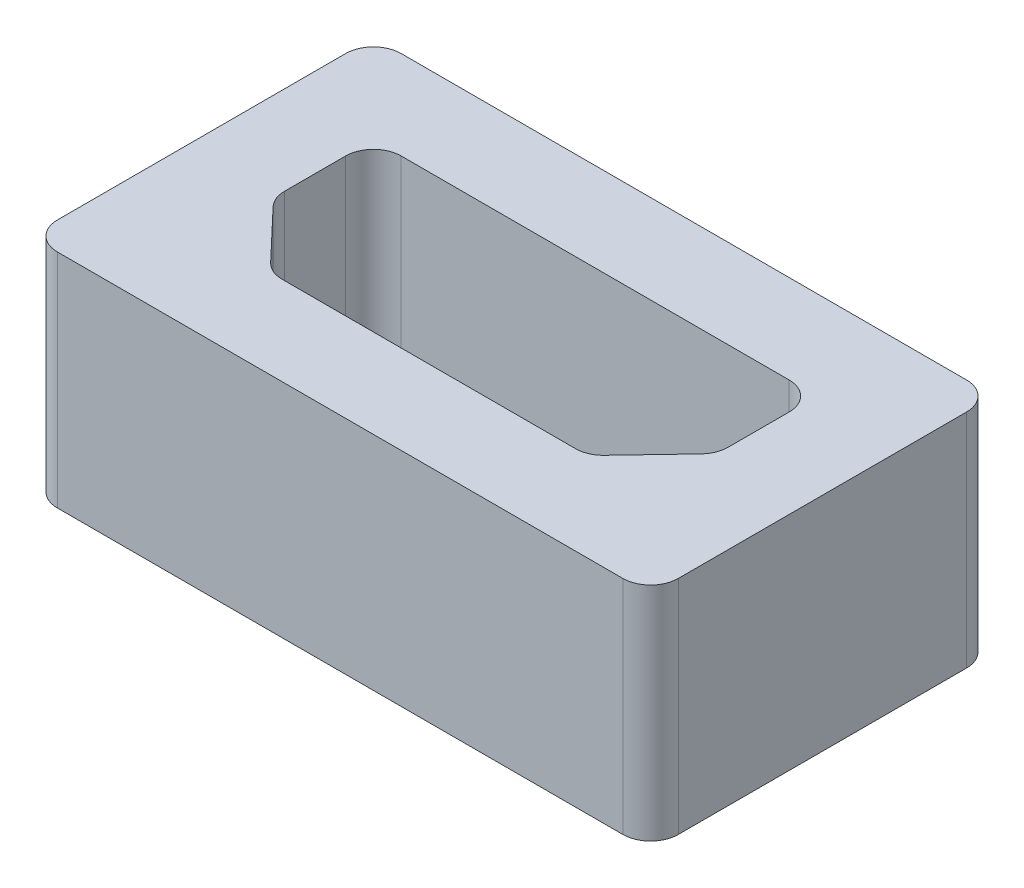
ISO-10303-21;
HEADER;
FILE_DESCRIPTION(('STEP AP214'),'2;1');
FILE_NAME('part.step','',(''),(''),'','','');
FILE_SCHEMA(('AUTOMOTIVE_DESIGN { 1 0 10303 214 1 1 1 1 }'));
ENDSEC;
DATA;
#1=APPLICATION_CONTEXT('core data for automotive mechanical design processes');
#2=APPLICATION_PROTOCOL_DEFINITION('international standard','automotive_design',2000,#1);
#3=PRODUCT_CONTEXT('',#1,'mechanical');
#4=PRODUCT('Part','Part','',(#3));
#5=PRODUCT_RELATED_PRODUCT_CATEGORY('part','',(#4));
#6=PRODUCT_DEFINITION_FORMATION('','',#4);
#7=PRODUCT_DEFINITION_CONTEXT('part definition',#1,'design');
#8=PRODUCT_DEFINITION('design','',#6,#7);
#9=PRODUCT_DEFINITION_SHAPE('','',#8);
#10=(LENGTH_UNIT() NAMED_UNIT(*) SI_UNIT(.MILLI.,.METRE.));
#11=(NAMED_UNIT(*) PLANE_ANGLE_UNIT() SI_UNIT($,.RADIAN.));
#12=(NAMED_UNIT(*) SI_UNIT($,.STERADIAN.) SOLID_ANGLE_UNIT());
#13=UNCERTAINTY_MEASURE_WITH_UNIT(LENGTH_MEASURE(1.E-05),#10,'distance_accuracy_value','');
#14=(GEOMETRIC_REPRESENTATION_CONTEXT(3) GLOBAL_UNCERTAINTY_ASSIGNED_CONTEXT((#13)) GLOBAL_UNIT_ASSIGNED_CONTEXT((#10,
#11,#12)) REPRESENTATION_CONTEXT('',''));
#15=CARTESIAN_POINT('',(0.,0.,0.));
#16=DIRECTION('',(0.,0.,1.));
#17=DIRECTION('',(1.,0.,0.));
#18=AXIS2_PLACEMENT_3D('',#15,#16,#17);
#19=CARTESIAN_POINT('',(0.,4.,-4.6));
#20=DIRECTION('',(0.,0.,-1.));
#21=DIRECTION('',(-1.,0.,0.));
#22=AXIS2_PLACEMENT_3D('',#19,#20,#21);
#23=PLANE('',#22);
#24=DIRECTION('',(1.,0.,0.));
#25=VECTOR('',#24,1.);
#26=CARTESIAN_POINT('',(0.,0.,-4.6));
#27=LINE('',#26,#25);
#28=CARTESIAN_POINT('',(-1.1,0.,-4.6));
#29=VERTEX_POINT('',#28);
#30=CARTESIAN_POINT('',(9.1,0.,-4.6));
#31=VERTEX_POINT('',#30);
#32=EDGE_CURVE('E213',#29,#31,#27,.T.);
#33=ORIENTED_EDGE('',*,*,#32,.F.);
#34=DIRECTION('',(0.,-1.,0.));
#35=VECTOR('',#34,1.);
#36=CARTESIAN_POINT('',(-1.1,4.,-4.6));
#37=LINE('',#36,#35);
#38=CARTESIAN_POINT('',(-1.1,4.,-4.6));
#39=VERTEX_POINT('',#38);
#40=EDGE_CURVE('E263',#29,#39,#37,.F.);
#41=ORIENTED_EDGE('',*,*,#40,.T.);
#42=DIRECTION('',(1.,0.,0.));
#43=VECTOR('',#42,1.);
#44=CARTESIAN_POINT('',(0.,4.,-4.6));
#45=LINE('',#44,#43);
#46=CARTESIAN_POINT('',(9.1,4.,-4.6));
#47=VERTEX_POINT('',#46);
#48=EDGE_CURVE('E333',#39,#47,#45,.T.);
#49=ORIENTED_EDGE('',*,*,#48,.T.);
#50=DIRECTION('',(0.,-1.,0.));
#51=VECTOR('',#50,1.);
#52=CARTESIAN_POINT('',(9.1,0.,-4.6));
#53=LINE('',#52,#51);
#54=EDGE_CURVE('E260',#47,#31,#53,.T.);
#55=ORIENTED_EDGE('',*,*,#54,.T.);
#56=EDGE_LOOP('',(#33,#41,#49,#55));
#57=FACE_BOUND('',#56,.T.);
#58=ADVANCED_FACE('F35',(#57),#23,.T.);
#59=CARTESIAN_POINT('',(-1.6,4.,0.));
#60=DIRECTION('',(-1.,0.,0.));
#61=DIRECTION('',(0.,0.,1.));
#62=AXIS2_PLACEMENT_3D('',#59,#60,#61);
#63=PLANE('',#62);
#64=DIRECTION('',(0.,0.,-1.));
#65=VECTOR('',#64,1.);
#66=CARTESIAN_POINT('',(-1.6,0.,0.));
#67=LINE('',#66,#65);
#68=CARTESIAN_POINT('',(-1.6,0.,1.1));
#69=VERTEX_POINT('',#68);
#70=CARTESIAN_POINT('',(-1.6,0.,-4.1));
#71=VERTEX_POINT('',#70);
#72=EDGE_CURVE('E216',#69,#71,#67,.T.);
#73=ORIENTED_EDGE('',*,*,#72,.F.);
#74=DIRECTION('',(0.,-1.,0.));
#75=VECTOR('',#74,1.);
#76=CARTESIAN_POINT('',(-1.6,4.,1.1));
#77=LINE('',#76,#75);
#78=CARTESIAN_POINT('',(-1.6,4.,1.1));
#79=VERTEX_POINT('',#78);
#80=EDGE_CURVE('E251',#69,#79,#77,.F.);
#81=ORIENTED_EDGE('',*,*,#80,.T.);
#82=DIRECTION('',(0.,0.,-1.));
#83=VECTOR('',#82,1.);
#84=CARTESIAN_POINT('',(-1.6,4.,0.));
#85=LINE('',#84,#83);
#86=CARTESIAN_POINT('',(-1.6,4.,-4.1));
#87=VERTEX_POINT('',#86);
#88=EDGE_CURVE('E336',#79,#87,#85,.T.);
#89=ORIENTED_EDGE('',*,*,#88,.T.);
#90=DIRECTION('',(0.,-1.,0.));
#91=VECTOR('',#90,1.);
#92=CARTESIAN_POINT('',(-1.6,4.,-4.1));
#93=LINE('',#92,#91);
#94=EDGE_CURVE('E248',#87,#71,#93,.T.);
#95=ORIENTED_EDGE('',*,*,#94,.T.);
#96=EDGE_LOOP('',(#73,#81,#89,#95));
#97=FACE_BOUND('',#96,.T.);
#98=ADVANCED_FACE('F375',(#97),#63,.T.);
#99=CARTESIAN_POINT('',(0.,4.,1.6));
#100=DIRECTION('',(0.,0.,-1.));
#101=DIRECTION('',(-1.,0.,0.));
#102=AXIS2_PLACEMENT_3D('',#99,#100,#101);
#103=PLANE('',#102);
#104=DIRECTION('',(1.,0.,0.));
#105=VECTOR('',#104,1.);
#106=CARTESIAN_POINT('',(0.,4.,1.6));
#107=LINE('',#106,#105);
#108=CARTESIAN_POINT('',(-1.1,4.,1.6));
#109=VERTEX_POINT('',#108);
#110=CARTESIAN_POINT('',(9.1,4.,1.6));
#111=VERTEX_POINT('',#110);
#112=EDGE_CURVE('E339',#109,#111,#107,.T.);
#113=ORIENTED_EDGE('',*,*,#112,.F.);
#114=DIRECTION('',(0.,-1.,0.));
#115=VECTOR('',#114,1.);
#116=CARTESIAN_POINT('',(-1.1,0.,1.6));
#117=LINE('',#116,#115);
#118=CARTESIAN_POINT('',(-1.1,0.,1.6));
#119=VERTEX_POINT('',#118);
#120=EDGE_CURVE('E237',#109,#119,#117,.T.);
#121=ORIENTED_EDGE('',*,*,#120,.T.);
#122=DIRECTION('',(1.,0.,0.));
#123=VECTOR('',#122,1.);
#124=CARTESIAN_POINT('',(0.,0.,1.6));
#125=LINE('',#124,#123);
#126=CARTESIAN_POINT('',(9.1,0.,1.6));
#127=VERTEX_POINT('',#126);
#128=EDGE_CURVE('E219',#119,#127,#125,.T.);
#129=ORIENTED_EDGE('',*,*,#128,.T.);
#130=DIRECTION('',(0.,-1.,0.));
#131=VECTOR('',#130,1.);
#132=CARTESIAN_POINT('',(9.1,4.,1.6));
#133=LINE('',#132,#131);
#134=EDGE_CURVE('E235',#127,#111,#133,.F.);
#135=ORIENTED_EDGE('',*,*,#134,.T.);
#136=EDGE_LOOP('',(#113,#121,#129,#135));
#137=FACE_BOUND('',#136,.T.);
#138=ADVANCED_FACE('F381',(#137),#103,.F.);
#139=CARTESIAN_POINT('',(0.,4.,0.));
#140=DIRECTION('',(0.,0.,-1.));
#141=DIRECTION('',(-1.,0.,0.));
#142=AXIS2_PLACEMENT_3D('',#139,#140,#141);
#143=PLANE('',#142);
#144=DIRECTION('',(1.,0.,0.));
#145=VECTOR('',#144,1.);
#146=CARTESIAN_POINT('',(0.,0.,0.));
#147=LINE('',#146,#145);
#148=CARTESIAN_POINT('',(1.35313022490061,0.,0.));
#149=VERTEX_POINT('',#148);
#150=CARTESIAN_POINT('',(6.64686977509939,0.,0.));
#151=VERTEX_POINT('',#150);
#152=EDGE_CURVE('E303',#149,#151,#147,.T.);
#153=ORIENTED_EDGE('',*,*,#152,.F.);
#154=DIRECTION('',(0.,-1.,0.));
#155=VECTOR('',#154,1.);
#156=CARTESIAN_POINT('',(1.35313022490061,4.,0.));
#157=LINE('',#156,#155);
#158=CARTESIAN_POINT('',(1.35313022490061,4.,0.));
#159=VERTEX_POINT('',#158);
#160=EDGE_CURVE('E277',#149,#159,#157,.F.);
#161=ORIENTED_EDGE('',*,*,#160,.T.);
#162=DIRECTION('',(1.,0.,0.));
#163=VECTOR('',#162,1.);
#164=CARTESIAN_POINT('',(0.,4.,0.));
#165=LINE('',#164,#163);
#166=CARTESIAN_POINT('',(6.64686977509939,4.,0.));
#167=VERTEX_POINT('',#166);
#168=EDGE_CURVE('E224',#159,#167,#165,.T.);
#169=ORIENTED_EDGE('',*,*,#168,.T.);
#170=DIRECTION('',(0.,-1.,0.));
#171=VECTOR('',#170,1.);
#172=CARTESIAN_POINT('',(6.64686977509939,0.,0.));
#173=LINE('',#172,#171);
#174=EDGE_CURVE('E274',#167,#151,#173,.T.);
#175=ORIENTED_EDGE('',*,*,#174,.T.);
#176=EDGE_LOOP('',(#153,#161,#169,#175));
#177=FACE_BOUND('',#176,.T.);
#178=ADVANCED_FACE('F320',(#177),#143,.T.);
#179=CARTESIAN_POINT('',(0.598174748818325,4.,-0.56853854528721));
#180=DIRECTION('',(-0.724834509162904,0.,0.688923024964743));
#181=DIRECTION('',(0.688923024964743,0.,0.724834509162904));
#182=AXIS2_PLACEMENT_3D('',#179,#180,#181);
#183=PLANE('',#182);
#184=DIRECTION('',(-0.688923024964743,0.,-0.724834509162904));
#185=VECTOR('',#184,1.);
#186=CARTESIAN_POINT('',(0.598174748818325,4.,-0.56853854528721));
#187=LINE('',#186,#185);
#188=CARTESIAN_POINT('',(0.990712970319155,4.,-0.155538487517629));
#189=VERTEX_POINT('',#188);
#190=CARTESIAN_POINT('',(0.137582745418548,4.,-1.05313982382006));
#191=VERTEX_POINT('',#190);
#192=EDGE_CURVE('E322',#189,#191,#187,.T.);
#193=ORIENTED_EDGE('',*,*,#192,.F.);
#194=DIRECTION('',(0.,-1.,0.));
#195=VECTOR('',#194,1.);
#196=CARTESIAN_POINT('',(0.990712970319155,4.,-0.155538487517629));
#197=LINE('',#196,#195);
#198=CARTESIAN_POINT('',(0.990712970319155,0.,-0.155538487517629));
#199=VERTEX_POINT('',#198);
#200=EDGE_CURVE('E271',#189,#199,#197,.T.);
#201=ORIENTED_EDGE('',*,*,#200,.T.);
#202=DIRECTION('',(-0.688923024964743,0.,-0.724834509162904));
#203=VECTOR('',#202,1.);
#204=CARTESIAN_POINT('',(0.598174748818325,0.,-0.56853854528721));
#205=LINE('',#204,#203);
#206=CARTESIAN_POINT('',(0.137582745418548,0.,-1.05313982382006));
#207=VERTEX_POINT('',#206);
#208=EDGE_CURVE('E207',#199,#207,#205,.T.);
#209=ORIENTED_EDGE('',*,*,#208,.T.);
#210=DIRECTION('',(0.,-1.,0.));
#211=VECTOR('',#210,1.);
#212=CARTESIAN_POINT('',(0.137582745418548,4.,-1.05313982382006));
#213=LINE('',#212,#211);
#214=EDGE_CURVE('E269',#207,#191,#213,.F.);
#215=ORIENTED_EDGE('',*,*,#214,.T.);
#216=EDGE_LOOP('',(#193,#201,#209,#215));
#217=FACE_BOUND('',#216,.T.);
#218=ADVANCED_FACE('F346',(#217),#183,.F.);
#219=CARTESIAN_POINT('',(0.,4.,0.));
#220=DIRECTION('',(-1.,0.,0.));
#221=DIRECTION('',(0.,0.,1.));
#222=AXIS2_PLACEMENT_3D('',#219,#220,#221);
#223=PLANE('',#222);
#224=DIRECTION('',(0.,0.,-1.));
#225=VECTOR('',#224,1.);
#226=CARTESIAN_POINT('',(0.,4.,0.));
#227=LINE('',#226,#225);
#228=CARTESIAN_POINT('',(0.,4.,-1.39760133630244));
#229=VERTEX_POINT('',#228);
#230=CARTESIAN_POINT('',(0.,4.,-2.5));
#231=VERTEX_POINT('',#230);
#232=EDGE_CURVE('E325',#229,#231,#227,.T.);
#233=ORIENTED_EDGE('',*,*,#232,.F.);
#234=DIRECTION('',(0.,-1.,0.));
#235=VECTOR('',#234,1.);
#236=CARTESIAN_POINT('',(0.,0.,-1.39760133630244));
#237=LINE('',#236,#235);
#238=CARTESIAN_POINT('',(0.,0.,-1.39760133630244));
#239=VERTEX_POINT('',#238);
#240=EDGE_CURVE('E279',#229,#239,#237,.T.);
#241=ORIENTED_EDGE('',*,*,#240,.T.);
#242=DIRECTION('',(0.,0.,-1.));
#243=VECTOR('',#242,1.);
#244=CARTESIAN_POINT('',(0.,0.,0.));
#245=LINE('',#244,#243);
#246=CARTESIAN_POINT('',(0.,0.,-2.5));
#247=VERTEX_POINT('',#246);
#248=EDGE_CURVE('E203',#239,#247,#245,.T.);
#249=ORIENTED_EDGE('',*,*,#248,.T.);
#250=DIRECTION('',(0.,-1.,0.));
#251=VECTOR('',#250,1.);
#252=CARTESIAN_POINT('',(0.,4.,-2.5));
#253=LINE('',#252,#251);
#254=EDGE_CURVE('E180',#247,#231,#253,.F.);
#255=ORIENTED_EDGE('',*,*,#254,.T.);
#256=EDGE_LOOP('',(#233,#241,#249,#255));
#257=FACE_BOUND('',#256,.T.);
#258=ADVANCED_FACE('F354',(#257),#223,.F.);
#259=CARTESIAN_POINT('',(0.,4.,-3.));
#260=DIRECTION('',(0.,0.,-1.));
#261=DIRECTION('',(-1.,0.,0.));
#262=AXIS2_PLACEMENT_3D('',#259,#260,#261);
#263=PLANE('',#262);
#264=DIRECTION('',(1.,0.,0.));
#265=VECTOR('',#264,1.);
#266=CARTESIAN_POINT('',(0.,4.,-3.));
#267=LINE('',#266,#265);
#268=CARTESIAN_POINT('',(0.5,4.,-3.));
#269=VERTEX_POINT('',#268);
#270=CARTESIAN_POINT('',(7.5,4.,-3.));
#271=VERTEX_POINT('',#270);
#272=EDGE_CURVE('E194',#269,#271,#267,.T.);
#273=ORIENTED_EDGE('',*,*,#272,.F.);
#274=DIRECTION('',(0.,-1.,0.));
#275=VECTOR('',#274,1.);
#276=CARTESIAN_POINT('',(0.5,0.,-3.));
#277=LINE('',#276,#275);
#278=CARTESIAN_POINT('',(0.5,0.,-3.));
#279=VERTEX_POINT('',#278);
#280=EDGE_CURVE('E178',#269,#279,#277,.T.);
#281=ORIENTED_EDGE('',*,*,#280,.T.);
#282=DIRECTION('',(1.,0.,0.));
#283=VECTOR('',#282,1.);
#284=CARTESIAN_POINT('',(0.,0.,-3.));
#285=LINE('',#284,#283);
#286=CARTESIAN_POINT('',(7.5,0.,-3.));
#287=VERTEX_POINT('',#286);
#288=EDGE_CURVE('E191',#279,#287,#285,.T.);
#289=ORIENTED_EDGE('',*,*,#288,.T.);
#290=DIRECTION('',(0.,-1.,0.));
#291=VECTOR('',#290,1.);
#292=CARTESIAN_POINT('',(7.5,4.,-3.));
#293=LINE('',#292,#291);
#294=EDGE_CURVE('E195',#287,#271,#293,.F.);
#295=ORIENTED_EDGE('',*,*,#294,.T.);
#296=EDGE_LOOP('',(#273,#281,#289,#295));
#297=FACE_BOUND('',#296,.T.);
#298=ADVANCED_FACE('F190',(#297),#263,.F.);
#299=CARTESIAN_POINT('',(8.,4.,0.));
#300=DIRECTION('',(-1.,0.,0.));
#301=DIRECTION('',(0.,0.,1.));
#302=AXIS2_PLACEMENT_3D('',#299,#300,#301);
#303=PLANE('',#302);
#304=DIRECTION('',(0.,0.,-1.));
#305=VECTOR('',#304,1.);
#306=CARTESIAN_POINT('',(8.,0.,0.));
#307=LINE('',#306,#305);
#308=CARTESIAN_POINT('',(8.,0.,-1.39760133630244));
#309=VERTEX_POINT('',#308);
#310=CARTESIAN_POINT('',(8.,0.,-2.5));
#311=VERTEX_POINT('',#310);
#312=EDGE_CURVE('E202',#309,#311,#307,.T.);
#313=ORIENTED_EDGE('',*,*,#312,.F.);
#314=DIRECTION('',(0.,-1.,0.));
#315=VECTOR('',#314,1.);
#316=CARTESIAN_POINT('',(8.,4.,-1.39760133630244));
#317=LINE('',#316,#315);
#318=CARTESIAN_POINT('',(8.,4.,-1.39760133630244));
#319=VERTEX_POINT('',#318);
#320=EDGE_CURVE('E287',#309,#319,#317,.F.);
#321=ORIENTED_EDGE('',*,*,#320,.T.);
#322=DIRECTION('',(0.,0.,-1.));
#323=VECTOR('',#322,1.);
#324=CARTESIAN_POINT('',(8.,4.,0.));
#325=LINE('',#324,#323);
#326=CARTESIAN_POINT('',(8.,4.,-2.5));
#327=VERTEX_POINT('',#326);
#328=EDGE_CURVE('E330',#319,#327,#325,.T.);
#329=ORIENTED_EDGE('',*,*,#328,.T.);
#330=DIRECTION('',(0.,-1.,0.));
#331=VECTOR('',#330,1.);
#332=CARTESIAN_POINT('',(8.,4.,-2.5));
#333=LINE('',#332,#331);
#334=EDGE_CURVE('E185',#327,#311,#333,.T.);
#335=ORIENTED_EDGE('',*,*,#334,.T.);
#336=EDGE_LOOP('',(#313,#321,#329,#335));
#337=FACE_BOUND('',#336,.T.);
#338=ADVANCED_FACE('F362',(#337),#303,.T.);
#339=CARTESIAN_POINT('',(3.6049057765691,4.,3.42630291592353));
#340=DIRECTION('',(-0.724834509162904,0.,-0.688923024964743));
#341=DIRECTION('',(-0.688923024964743,0.,0.724834509162904));
#342=AXIS2_PLACEMENT_3D('',#339,#340,#341);
#343=PLANE('',#342);
#344=DIRECTION('',(0.688923024964743,0.,-0.724834509162904));
#345=VECTOR('',#344,1.);
#346=CARTESIAN_POINT('',(3.6049057765691,4.,3.42630291592353));
#347=LINE('',#346,#345);
#348=CARTESIAN_POINT('',(7.00928702968084,4.,-0.155538487517629));
#349=VERTEX_POINT('',#348);
#350=CARTESIAN_POINT('',(7.86241725458145,4.,-1.05313982382007));
#351=VERTEX_POINT('',#350);
#352=EDGE_CURVE('E318',#349,#351,#347,.T.);
#353=ORIENTED_EDGE('',*,*,#352,.T.);
#354=DIRECTION('',(0.,-1.,0.));
#355=VECTOR('',#354,1.);
#356=CARTESIAN_POINT('',(7.86241725458145,0.,-1.05313982382007));
#357=LINE('',#356,#355);
#358=CARTESIAN_POINT('',(7.86241725458145,0.,-1.05313982382007));
#359=VERTEX_POINT('',#358);
#360=EDGE_CURVE('E284',#351,#359,#357,.T.);
#361=ORIENTED_EDGE('',*,*,#360,.T.);
#362=DIRECTION('',(0.688923024964743,0.,-0.724834509162904));
#363=VECTOR('',#362,1.);
#364=CARTESIAN_POINT('',(3.6049057765691,0.,3.42630291592353));
#365=LINE('',#364,#363);
#366=CARTESIAN_POINT('',(7.00928702968084,0.,-0.155538487517629));
#367=VERTEX_POINT('',#366);
#368=EDGE_CURVE('E205',#367,#359,#365,.T.);
#369=ORIENTED_EDGE('',*,*,#368,.F.);
#370=DIRECTION('',(0.,-1.,0.));
#371=VECTOR('',#370,1.);
#372=CARTESIAN_POINT('',(7.00928702968084,4.,-0.155538487517628));
#373=LINE('',#372,#371);
#374=EDGE_CURVE('E282',#367,#349,#373,.F.);
#375=ORIENTED_EDGE('',*,*,#374,.T.);
#376=EDGE_LOOP('',(#353,#361,#369,#375));
#377=FACE_BOUND('',#376,.T.);
#378=ADVANCED_FACE('F309',(#377),#343,.T.);
#379=CARTESIAN_POINT('',(9.6,4.,0.));
#380=DIRECTION('',(-1.,0.,0.));
#381=DIRECTION('',(0.,0.,1.));
#382=AXIS2_PLACEMENT_3D('',#379,#380,#381);
#383=PLANE('',#382);
#384=DIRECTION('',(0.,0.,-1.));
#385=VECTOR('',#384,1.);
#386=CARTESIAN_POINT('',(9.6,4.,0.));
#387=LINE('',#386,#385);
#388=CARTESIAN_POINT('',(9.6,4.,1.1));
#389=VERTEX_POINT('',#388);
#390=CARTESIAN_POINT('',(9.6,4.,-4.1));
#391=VERTEX_POINT('',#390);
#392=EDGE_CURVE('E225',#389,#391,#387,.T.);
#393=ORIENTED_EDGE('',*,*,#392,.F.);
#394=DIRECTION('',(0.,-1.,0.));
#395=VECTOR('',#394,1.);
#396=CARTESIAN_POINT('',(9.6,4.,1.1));
#397=LINE('',#396,#395);
#398=CARTESIAN_POINT('',(9.6,0.,1.1));
#399=VERTEX_POINT('',#398);
#400=EDGE_CURVE('E266',#389,#399,#397,.T.);
#401=ORIENTED_EDGE('',*,*,#400,.T.);
#402=DIRECTION('',(0.,0.,-1.));
#403=VECTOR('',#402,1.);
#404=CARTESIAN_POINT('',(9.6,0.,0.));
#405=LINE('',#404,#403);
#406=CARTESIAN_POINT('',(9.6,0.,-4.1));
#407=VERTEX_POINT('',#406);
#408=EDGE_CURVE('E222',#399,#407,#405,.T.);
#409=ORIENTED_EDGE('',*,*,#408,.T.);
#410=DIRECTION('',(0.,-1.,0.));
#411=VECTOR('',#410,1.);
#412=CARTESIAN_POINT('',(9.6,4.,-4.1));
#413=LINE('',#412,#411);
#414=EDGE_CURVE('E50',#407,#391,#413,.F.);
#415=ORIENTED_EDGE('',*,*,#414,.T.);
#416=EDGE_LOOP('',(#393,#401,#409,#415));
#417=FACE_BOUND('',#416,.T.);
#418=ADVANCED_FACE('F389',(#417),#383,.F.);
#419=CARTESIAN_POINT('',(0.,4.,0.));
#420=DIRECTION('',(0.,1.,0.));
#421=DIRECTION('',(0.,0.,1.));
#422=AXIS2_PLACEMENT_3D('',#419,#420,#421);
#423=PLANE('',#422);
#424=ORIENTED_EDGE('',*,*,#168,.F.);
#425=CARTESIAN_POINT('',(1.35313022490061,4.,-0.5));
#426=DIRECTION('',(0.,1.,0.));
#427=DIRECTION('',(0.,0.,1.));
#428=AXIS2_PLACEMENT_3D('',#425,#426,#427);
#429=CIRCLE('',#428,0.5);
#430=EDGE_CURVE('E291',#159,#189,#429,.F.);
#431=ORIENTED_EDGE('',*,*,#430,.T.);
#432=ORIENTED_EDGE('',*,*,#192,.T.);
#433=CARTESIAN_POINT('',(0.5,4.,-1.39760133630244));
#434=DIRECTION('',(0.,1.,0.));
#435=DIRECTION('',(0.,0.,1.));
#436=AXIS2_PLACEMENT_3D('',#433,#434,#435);
#437=CIRCLE('',#436,0.5);
#438=EDGE_CURVE('E295',#191,#229,#437,.F.);
#439=ORIENTED_EDGE('',*,*,#438,.T.);
#440=ORIENTED_EDGE('',*,*,#232,.T.);
#441=CARTESIAN_POINT('',(0.5,4.,-2.5));
#442=DIRECTION('',(0.,1.,0.));
#443=DIRECTION('',(0.,0.,1.));
#444=AXIS2_PLACEMENT_3D('',#441,#442,#443);
#445=CIRCLE('',#444,0.5);
#446=EDGE_CURVE('E184',#231,#269,#445,.F.);
#447=ORIENTED_EDGE('',*,*,#446,.T.);
#448=ORIENTED_EDGE('',*,*,#272,.T.);
#449=CARTESIAN_POINT('',(7.5,4.,-2.5));
#450=DIRECTION('',(0.,1.,0.));
#451=DIRECTION('',(0.,0.,1.));
#452=AXIS2_PLACEMENT_3D('',#449,#450,#451);
#453=CIRCLE('',#452,0.5);
#454=EDGE_CURVE('E232',#271,#327,#453,.F.);
#455=ORIENTED_EDGE('',*,*,#454,.T.);
#456=ORIENTED_EDGE('',*,*,#328,.F.);
#457=CARTESIAN_POINT('',(7.5,4.,-1.39760133630244));
#458=DIRECTION('',(0.,1.,0.));
#459=DIRECTION('',(0.,0.,1.));
#460=AXIS2_PLACEMENT_3D('',#457,#458,#459);
#461=CIRCLE('',#460,0.5);
#462=EDGE_CURVE('E299',#319,#351,#461,.F.);
#463=ORIENTED_EDGE('',*,*,#462,.T.);
#464=ORIENTED_EDGE('',*,*,#352,.F.);
#465=CARTESIAN_POINT('',(6.64686977509939,4.,-0.5));
#466=DIRECTION('',(0.,1.,0.));
#467=DIRECTION('',(0.,0.,1.));
#468=AXIS2_PLACEMENT_3D('',#465,#466,#467);
#469=CIRCLE('',#468,0.5);
#470=EDGE_CURVE('E11',#349,#167,#469,.F.);
#471=ORIENTED_EDGE('',*,*,#470,.T.);
#472=EDGE_LOOP('',(#424,#431,#432,#439,#440,#447,#448,#455,#456,#463,#464,#471));
#473=FACE_BOUND('',#472,.T.);
#474=ORIENTED_EDGE('',*,*,#88,.F.);
#475=CARTESIAN_POINT('',(-1.1,4.,1.1));
#476=DIRECTION('',(0.,1.,0.));
#477=DIRECTION('',(0.,0.,1.));
#478=AXIS2_PLACEMENT_3D('',#475,#476,#477);
#479=CIRCLE('',#478,0.5);
#480=EDGE_CURVE('E258',#79,#109,#479,.T.);
#481=ORIENTED_EDGE('',*,*,#480,.T.);
#482=ORIENTED_EDGE('',*,*,#112,.T.);
#483=CARTESIAN_POINT('',(9.1,4.,1.1));
#484=DIRECTION('',(0.,1.,0.));
#485=DIRECTION('',(0.,0.,1.));
#486=AXIS2_PLACEMENT_3D('',#483,#484,#485);
#487=CIRCLE('',#486,0.5);
#488=EDGE_CURVE('E57',#111,#389,#487,.T.);
#489=ORIENTED_EDGE('',*,*,#488,.T.);
#490=ORIENTED_EDGE('',*,*,#392,.T.);
#491=CARTESIAN_POINT('',(9.1,4.,-4.1));
#492=DIRECTION('',(0.,1.,0.));
#493=DIRECTION('',(0.,0.,1.));
#494=AXIS2_PLACEMENT_3D('',#491,#492,#493);
#495=CIRCLE('',#494,0.5);
#496=EDGE_CURVE('E253',#391,#47,#495,.T.);
#497=ORIENTED_EDGE('',*,*,#496,.T.);
#498=ORIENTED_EDGE('',*,*,#48,.F.);
#499=CARTESIAN_POINT('',(-1.1,4.,-4.1));
#500=DIRECTION('',(0.,1.,0.));
#501=DIRECTION('',(0.,0.,1.));
#502=AXIS2_PLACEMENT_3D('',#499,#500,#501);
#503=CIRCLE('',#502,0.5);
#504=EDGE_CURVE('E256',#39,#87,#503,.T.);
#505=ORIENTED_EDGE('',*,*,#504,.T.);
#506=EDGE_LOOP('',(#474,#481,#482,#489,#490,#497,#498,#505));
#507=FACE_BOUND('',#506,.T.);
#508=ADVANCED_FACE('F316',(#473,#507),#423,.T.);
#509=CARTESIAN_POINT('',(0.,0.,0.));
#510=DIRECTION('',(0.,1.,0.));
#511=DIRECTION('',(0.,0.,1.));
#512=AXIS2_PLACEMENT_3D('',#509,#510,#511);
#513=PLANE('',#512);
#514=ORIENTED_EDGE('',*,*,#208,.F.);
#515=CARTESIAN_POINT('',(1.35313022490061,0.,-0.5));
#516=DIRECTION('',(0.,1.,0.));
#517=DIRECTION('',(0.,0.,1.));
#518=AXIS2_PLACEMENT_3D('',#515,#516,#517);
#519=CIRCLE('',#518,0.5);
#520=EDGE_CURVE('E289',#199,#149,#519,.T.);
#521=ORIENTED_EDGE('',*,*,#520,.T.);
#522=ORIENTED_EDGE('',*,*,#152,.T.);
#523=CARTESIAN_POINT('',(6.64686977509939,0.,-0.5));
#524=DIRECTION('',(0.,1.,0.));
#525=DIRECTION('',(0.,0.,1.));
#526=AXIS2_PLACEMENT_3D('',#523,#524,#525);
#527=CIRCLE('',#526,0.5);
#528=EDGE_CURVE('E43',#151,#367,#527,.T.);
#529=ORIENTED_EDGE('',*,*,#528,.T.);
#530=ORIENTED_EDGE('',*,*,#368,.T.);
#531=CARTESIAN_POINT('',(7.5,0.,-1.39760133630244));
#532=DIRECTION('',(0.,1.,0.));
#533=DIRECTION('',(0.,0.,1.));
#534=AXIS2_PLACEMENT_3D('',#531,#532,#533);
#535=CIRCLE('',#534,0.5);
#536=EDGE_CURVE('E297',#359,#309,#535,.T.);
#537=ORIENTED_EDGE('',*,*,#536,.T.);
#538=ORIENTED_EDGE('',*,*,#312,.T.);
#539=CARTESIAN_POINT('',(7.5,0.,-2.5));
#540=DIRECTION('',(0.,1.,0.));
#541=DIRECTION('',(0.,0.,1.));
#542=AXIS2_PLACEMENT_3D('',#539,#540,#541);
#543=CIRCLE('',#542,0.5);
#544=EDGE_CURVE('E201',#311,#287,#543,.T.);
#545=ORIENTED_EDGE('',*,*,#544,.T.);
#546=ORIENTED_EDGE('',*,*,#288,.F.);
#547=CARTESIAN_POINT('',(0.5,0.,-2.5));
#548=DIRECTION('',(0.,1.,0.));
#549=DIRECTION('',(0.,0.,1.));
#550=AXIS2_PLACEMENT_3D('',#547,#548,#549);
#551=CIRCLE('',#550,0.5);
#552=EDGE_CURVE('E174',#279,#247,#551,.T.);
#553=ORIENTED_EDGE('',*,*,#552,.T.);
#554=ORIENTED_EDGE('',*,*,#248,.F.);
#555=CARTESIAN_POINT('',(0.5,0.,-1.39760133630244));
#556=DIRECTION('',(0.,1.,0.));
#557=DIRECTION('',(0.,0.,1.));
#558=AXIS2_PLACEMENT_3D('',#555,#556,#557);
#559=CIRCLE('',#558,0.5);
#560=EDGE_CURVE('E293',#239,#207,#559,.T.);
#561=ORIENTED_EDGE('',*,*,#560,.T.);
#562=EDGE_LOOP('',(#514,#521,#522,#529,#530,#537,#538,#545,#546,#553,#554,#561));
#563=FACE_BOUND('',#562,.T.);
#564=ORIENTED_EDGE('',*,*,#128,.F.);
#565=CARTESIAN_POINT('',(-1.1,0.,1.1));
#566=DIRECTION('',(0.,1.,0.));
#567=DIRECTION('',(0.,0.,1.));
#568=AXIS2_PLACEMENT_3D('',#565,#566,#567);
#569=CIRCLE('',#568,0.5);
#570=EDGE_CURVE('E246',#119,#69,#569,.F.);
#571=ORIENTED_EDGE('',*,*,#570,.T.);
#572=ORIENTED_EDGE('',*,*,#72,.T.);
#573=CARTESIAN_POINT('',(-1.1,0.,-4.1));
#574=DIRECTION('',(0.,1.,0.));
#575=DIRECTION('',(0.,0.,1.));
#576=AXIS2_PLACEMENT_3D('',#573,#574,#575);
#577=CIRCLE('',#576,0.5);
#578=EDGE_CURVE('E244',#71,#29,#577,.F.);
#579=ORIENTED_EDGE('',*,*,#578,.T.);
#580=ORIENTED_EDGE('',*,*,#32,.T.);
#581=CARTESIAN_POINT('',(9.1,0.,-4.1));
#582=DIRECTION('',(0.,1.,0.));
#583=DIRECTION('',(0.,0.,1.));
#584=AXIS2_PLACEMENT_3D('',#581,#582,#583);
#585=CIRCLE('',#584,0.5);
#586=EDGE_CURVE('E240',#31,#407,#585,.F.);
#587=ORIENTED_EDGE('',*,*,#586,.T.);
#588=ORIENTED_EDGE('',*,*,#408,.F.);
#589=CARTESIAN_POINT('',(9.1,0.,1.1));
#590=DIRECTION('',(0.,1.,0.));
#591=DIRECTION('',(0.,0.,1.));
#592=AXIS2_PLACEMENT_3D('',#589,#590,#591);
#593=CIRCLE('',#592,0.5);
#594=EDGE_CURVE('E242',#399,#127,#593,.F.);
#595=ORIENTED_EDGE('',*,*,#594,.T.);
#596=EDGE_LOOP('',(#564,#571,#572,#579,#580,#587,#588,#595));
#597=FACE_BOUND('',#596,.T.);
#598=ADVANCED_FACE('F198',(#563,#597),#513,.F.);
#599=CARTESIAN_POINT('',(0.5,4.,-2.5));
#600=DIRECTION('',(0.,1.,0.));
#601=DIRECTION('',(0.,0.,1.));
#602=AXIS2_PLACEMENT_3D('',#599,#600,#601);
#603=CYLINDRICAL_SURFACE('',#602,0.5);
#604=ORIENTED_EDGE('',*,*,#446,.F.);
#605=ORIENTED_EDGE('',*,*,#254,.F.);
#606=ORIENTED_EDGE('',*,*,#552,.F.);
#607=ORIENTED_EDGE('',*,*,#280,.F.);
#608=EDGE_LOOP('',(#604,#605,#606,#607));
#609=FACE_BOUND('',#608,.T.);
#610=ADVANCED_FACE('F177',(#609),#603,.F.);
#611=CARTESIAN_POINT('',(7.5,4.,-2.5));
#612=DIRECTION('',(0.,-1.,0.));
#613=DIRECTION('',(0.,0.,-1.));
#614=AXIS2_PLACEMENT_3D('',#611,#612,#613);
#615=CYLINDRICAL_SURFACE('',#614,0.5);
#616=ORIENTED_EDGE('',*,*,#454,.F.);
#617=ORIENTED_EDGE('',*,*,#294,.F.);
#618=ORIENTED_EDGE('',*,*,#544,.F.);
#619=ORIENTED_EDGE('',*,*,#334,.F.);
#620=EDGE_LOOP('',(#616,#617,#618,#619));
#621=FACE_BOUND('',#620,.T.);
#622=ADVANCED_FACE('F359',(#621),#615,.F.);
#623=CARTESIAN_POINT('',(-1.1,4.,1.1));
#624=DIRECTION('',(0.,1.,0.));
#625=DIRECTION('',(0.,0.,1.));
#626=AXIS2_PLACEMENT_3D('',#623,#624,#625);
#627=CYLINDRICAL_SURFACE('',#626,0.5);
#628=ORIENTED_EDGE('',*,*,#480,.F.);
#629=ORIENTED_EDGE('',*,*,#80,.F.);
#630=ORIENTED_EDGE('',*,*,#570,.F.);
#631=ORIENTED_EDGE('',*,*,#120,.F.);
#632=EDGE_LOOP('',(#628,#629,#630,#631));
#633=FACE_BOUND('',#632,.T.);
#634=ADVANCED_FACE('F404',(#633),#627,.T.);
#635=CARTESIAN_POINT('',(-1.1,4.,-4.1));
#636=DIRECTION('',(0.,-1.,0.));
#637=DIRECTION('',(0.,0.,-1.));
#638=AXIS2_PLACEMENT_3D('',#635,#636,#637);
#639=CYLINDRICAL_SURFACE('',#638,0.5);
#640=ORIENTED_EDGE('',*,*,#504,.F.);
#641=ORIENTED_EDGE('',*,*,#40,.F.);
#642=ORIENTED_EDGE('',*,*,#578,.F.);
#643=ORIENTED_EDGE('',*,*,#94,.F.);
#644=EDGE_LOOP('',(#640,#641,#642,#643));
#645=FACE_BOUND('',#644,.T.);
#646=ADVANCED_FACE('F407',(#645),#639,.T.);
#647=CARTESIAN_POINT('',(9.1,4.,1.1));
#648=DIRECTION('',(0.,-1.,0.));
#649=DIRECTION('',(0.,0.,-1.));
#650=AXIS2_PLACEMENT_3D('',#647,#648,#649);
#651=CYLINDRICAL_SURFACE('',#650,0.5);
#652=ORIENTED_EDGE('',*,*,#488,.F.);
#653=ORIENTED_EDGE('',*,*,#134,.F.);
#654=ORIENTED_EDGE('',*,*,#594,.F.);
#655=ORIENTED_EDGE('',*,*,#400,.F.);
#656=EDGE_LOOP('',(#652,#653,#654,#655));
#657=FACE_BOUND('',#656,.T.);
#658=ADVANCED_FACE('F411',(#657),#651,.T.);
#659=CARTESIAN_POINT('',(9.1,4.,-4.1));
#660=DIRECTION('',(0.,1.,0.));
#661=DIRECTION('',(0.,0.,1.));
#662=AXIS2_PLACEMENT_3D('',#659,#660,#661);
#663=CYLINDRICAL_SURFACE('',#662,0.5);
#664=ORIENTED_EDGE('',*,*,#496,.F.);
#665=ORIENTED_EDGE('',*,*,#414,.F.);
#666=ORIENTED_EDGE('',*,*,#586,.F.);
#667=ORIENTED_EDGE('',*,*,#54,.F.);
#668=EDGE_LOOP('',(#664,#665,#666,#667));
#669=FACE_BOUND('',#668,.T.);
#670=ADVANCED_FACE('F415',(#669),#663,.T.);
#671=CARTESIAN_POINT('',(1.35313022490061,4.,-0.5));
#672=DIRECTION('',(0.,-1.,0.));
#673=DIRECTION('',(0.,0.,-1.));
#674=AXIS2_PLACEMENT_3D('',#671,#672,#673);
#675=CYLINDRICAL_SURFACE('',#674,0.5);
#676=ORIENTED_EDGE('',*,*,#430,.F.);
#677=ORIENTED_EDGE('',*,*,#160,.F.);
#678=ORIENTED_EDGE('',*,*,#520,.F.);
#679=ORIENTED_EDGE('',*,*,#200,.F.);
#680=EDGE_LOOP('',(#676,#677,#678,#679));
#681=FACE_BOUND('',#680,.T.);
#682=ADVANCED_FACE('F372',(#681),#675,.F.);
#683=CARTESIAN_POINT('',(0.5,4.,-1.39760133630244));
#684=DIRECTION('',(0.,1.,0.));
#685=DIRECTION('',(0.,0.,1.));
#686=AXIS2_PLACEMENT_3D('',#683,#684,#685);
#687=CYLINDRICAL_SURFACE('',#686,0.5);
#688=ORIENTED_EDGE('',*,*,#438,.F.);
#689=ORIENTED_EDGE('',*,*,#214,.F.);
#690=ORIENTED_EDGE('',*,*,#560,.F.);
#691=ORIENTED_EDGE('',*,*,#240,.F.);
#692=EDGE_LOOP('',(#688,#689,#690,#691));
#693=FACE_BOUND('',#692,.T.);
#694=ADVANCED_FACE('F350',(#693),#687,.F.);
#695=CARTESIAN_POINT('',(7.5,4.,-1.39760133630244));
#696=DIRECTION('',(0.,1.,0.));
#697=DIRECTION('',(0.,0.,1.));
#698=AXIS2_PLACEMENT_3D('',#695,#696,#697);
#699=CYLINDRICAL_SURFACE('',#698,0.5);
#700=ORIENTED_EDGE('',*,*,#462,.F.);
#701=ORIENTED_EDGE('',*,*,#320,.F.);
#702=ORIENTED_EDGE('',*,*,#536,.F.);
#703=ORIENTED_EDGE('',*,*,#360,.F.);
#704=EDGE_LOOP('',(#700,#701,#702,#703));
#705=FACE_BOUND('',#704,.T.);
#706=ADVANCED_FACE('F366',(#705),#699,.F.);
#707=CARTESIAN_POINT('',(6.64686977509939,4.,-0.5));
#708=DIRECTION('',(0.,1.,0.));
#709=DIRECTION('',(0.,0.,1.));
#710=AXIS2_PLACEMENT_3D('',#707,#708,#709);
#711=CYLINDRICAL_SURFACE('',#710,0.5);
#712=ORIENTED_EDGE('',*,*,#470,.F.);
#713=ORIENTED_EDGE('',*,*,#374,.F.);
#714=ORIENTED_EDGE('',*,*,#528,.F.);
#715=ORIENTED_EDGE('',*,*,#174,.F.);
#716=EDGE_LOOP('',(#712,#713,#714,#715));
#717=FACE_BOUND('',#716,.T.);
#718=ADVANCED_FACE('F37',(#717),#711,.F.);
#719=CLOSED_SHELL('',(#58,#98,#138,#178,#218,#258,#298,#338,#378,#418,#508,#598,#610,#622,#634,
#646,#658,#670,#682,#694,#706,#718));
#720=MANIFOLD_SOLID_BREP('B2',#719);
#721=ADVANCED_BREP_SHAPE_REPRESENTATION('',(#18,#720),#14);
#722=SHAPE_DEFINITION_REPRESENTATION(#9,#721);
ENDSEC;
END-ISO-10303-21;
